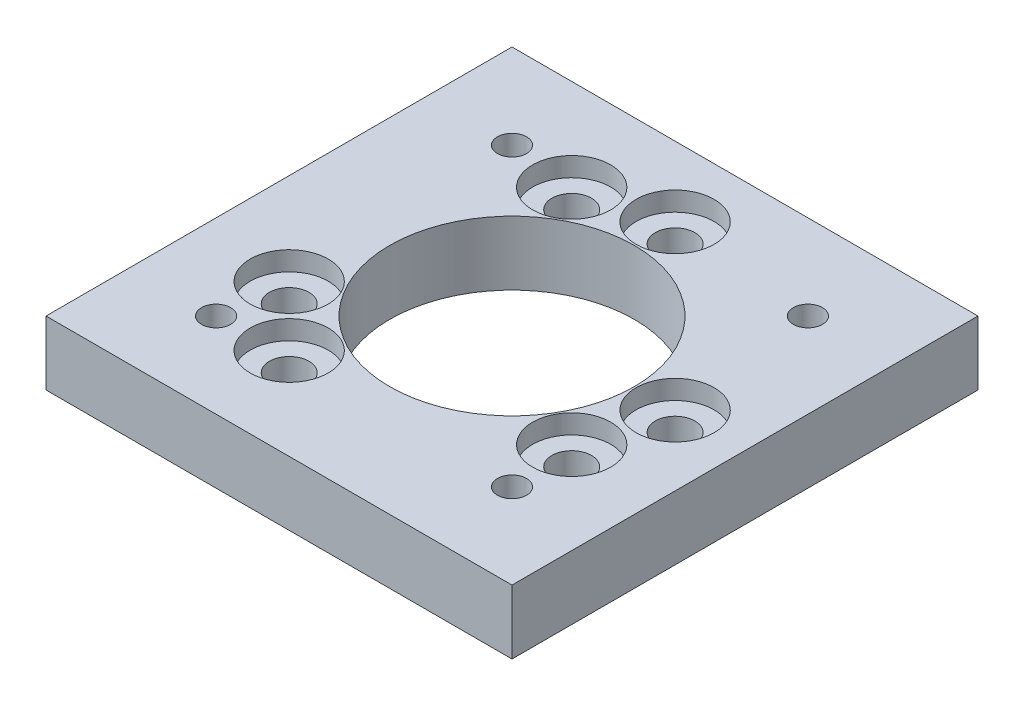
ISO-10303-21;
HEADER;
FILE_DESCRIPTION(('STEP AP214'),'2;1');
FILE_NAME('part.step','',(''),(''),'','','');
FILE_SCHEMA(('AUTOMOTIVE_DESIGN { 1 0 10303 214 1 1 1 1 }'));
ENDSEC;
DATA;
#1=APPLICATION_CONTEXT('core data for automotive mechanical design processes');
#2=APPLICATION_PROTOCOL_DEFINITION('international standard','automotive_design',2000,#1);
#3=PRODUCT_CONTEXT('',#1,'mechanical');
#4=PRODUCT('Part','Part','',(#3));
#5=PRODUCT_RELATED_PRODUCT_CATEGORY('part','',(#4));
#6=PRODUCT_DEFINITION_FORMATION('','',#4);
#7=PRODUCT_DEFINITION_CONTEXT('part definition',#1,'design');
#8=PRODUCT_DEFINITION('design','',#6,#7);
#9=PRODUCT_DEFINITION_SHAPE('','',#8);
#10=(LENGTH_UNIT() NAMED_UNIT(*) SI_UNIT(.MILLI.,.METRE.));
#11=(NAMED_UNIT(*) PLANE_ANGLE_UNIT() SI_UNIT($,.RADIAN.));
#12=(NAMED_UNIT(*) SI_UNIT($,.STERADIAN.) SOLID_ANGLE_UNIT());
#13=UNCERTAINTY_MEASURE_WITH_UNIT(LENGTH_MEASURE(1.E-05),#10,'distance_accuracy_value','');
#14=(GEOMETRIC_REPRESENTATION_CONTEXT(3) GLOBAL_UNCERTAINTY_ASSIGNED_CONTEXT((#13)) GLOBAL_UNIT_ASSIGNED_CONTEXT((#10,
#11,#12)) REPRESENTATION_CONTEXT('',''));
#15=CARTESIAN_POINT('',(0.,0.,0.));
#16=DIRECTION('',(0.,0.,1.));
#17=DIRECTION('',(1.,0.,0.));
#18=AXIS2_PLACEMENT_3D('',#15,#16,#17);
#19=CARTESIAN_POINT('',(20.,5.5,20.));
#20=DIRECTION('',(-1.,0.,0.));
#21=DIRECTION('',(0.,0.,1.));
#22=AXIS2_PLACEMENT_3D('',#19,#20,#21);
#23=PLANE('',#22);
#24=DIRECTION('',(0.,0.,-1.));
#25=VECTOR('',#24,1.);
#26=CARTESIAN_POINT('',(20.,0.,20.));
#27=LINE('',#26,#25);
#28=CARTESIAN_POINT('',(20.,0.,20.));
#29=VERTEX_POINT('',#28);
#30=CARTESIAN_POINT('',(20.,0.,-20.));
#31=VERTEX_POINT('',#30);
#32=EDGE_CURVE('E111',#29,#31,#27,.T.);
#33=ORIENTED_EDGE('',*,*,#32,.T.);
#34=DIRECTION('',(0.,-1.,0.));
#35=VECTOR('',#34,1.);
#36=CARTESIAN_POINT('',(20.,5.5,-20.));
#37=LINE('',#36,#35);
#38=CARTESIAN_POINT('',(20.,5.5,-20.));
#39=VERTEX_POINT('',#38);
#40=EDGE_CURVE('E11',#39,#31,#37,.T.);
#41=ORIENTED_EDGE('',*,*,#40,.F.);
#42=DIRECTION('',(0.,0.,-1.));
#43=VECTOR('',#42,1.);
#44=CARTESIAN_POINT('',(20.,5.5,20.));
#45=LINE('',#44,#43);
#46=CARTESIAN_POINT('',(20.,5.5,20.));
#47=VERTEX_POINT('',#46);
#48=EDGE_CURVE('E94',#47,#39,#45,.T.);
#49=ORIENTED_EDGE('',*,*,#48,.F.);
#50=DIRECTION('',(0.,-1.,0.));
#51=VECTOR('',#50,1.);
#52=CARTESIAN_POINT('',(20.,5.5,20.));
#53=LINE('',#52,#51);
#54=EDGE_CURVE('E107',#47,#29,#53,.T.);
#55=ORIENTED_EDGE('',*,*,#54,.T.);
#56=EDGE_LOOP('',(#33,#41,#49,#55));
#57=FACE_BOUND('',#56,.T.);
#58=ADVANCED_FACE('F40',(#57),#23,.F.);
#59=CARTESIAN_POINT('',(-20.,5.5,-20.));
#60=DIRECTION('',(0.,0.,1.));
#61=DIRECTION('',(1.,0.,0.));
#62=AXIS2_PLACEMENT_3D('',#59,#60,#61);
#63=PLANE('',#62);
#64=DIRECTION('',(-1.,0.,0.));
#65=VECTOR('',#64,1.);
#66=CARTESIAN_POINT('',(-20.,0.,-20.));
#67=LINE('',#66,#65);
#68=CARTESIAN_POINT('',(-20.,0.,-20.));
#69=VERTEX_POINT('',#68);
#70=EDGE_CURVE('E99',#31,#69,#67,.T.);
#71=ORIENTED_EDGE('',*,*,#70,.T.);
#72=DIRECTION('',(0.,-1.,0.));
#73=VECTOR('',#72,1.);
#74=CARTESIAN_POINT('',(-20.,5.5,-20.));
#75=LINE('',#74,#73);
#76=CARTESIAN_POINT('',(-20.,5.5,-20.));
#77=VERTEX_POINT('',#76);
#78=EDGE_CURVE('E50',#77,#69,#75,.T.);
#79=ORIENTED_EDGE('',*,*,#78,.F.);
#80=DIRECTION('',(-1.,0.,0.));
#81=VECTOR('',#80,1.);
#82=CARTESIAN_POINT('',(-20.,5.5,-20.));
#83=LINE('',#82,#81);
#84=EDGE_CURVE('E89',#39,#77,#83,.T.);
#85=ORIENTED_EDGE('',*,*,#84,.F.);
#86=ORIENTED_EDGE('',*,*,#40,.T.);
#87=EDGE_LOOP('',(#71,#79,#85,#86));
#88=FACE_BOUND('',#87,.T.);
#89=ADVANCED_FACE('F98',(#88),#63,.F.);
#90=CARTESIAN_POINT('',(-20.,5.5,20.));
#91=DIRECTION('',(1.,0.,0.));
#92=DIRECTION('',(0.,0.,-1.));
#93=AXIS2_PLACEMENT_3D('',#90,#91,#92);
#94=PLANE('',#93);
#95=DIRECTION('',(0.,0.,1.));
#96=VECTOR('',#95,1.);
#97=CARTESIAN_POINT('',(-20.,0.,20.));
#98=LINE('',#97,#96);
#99=CARTESIAN_POINT('',(-20.,0.,20.));
#100=VERTEX_POINT('',#99);
#101=EDGE_CURVE('E76',#69,#100,#98,.T.);
#102=ORIENTED_EDGE('',*,*,#101,.T.);
#103=DIRECTION('',(0.,-1.,0.));
#104=VECTOR('',#103,1.);
#105=CARTESIAN_POINT('',(-20.,5.5,20.));
#106=LINE('',#105,#104);
#107=CARTESIAN_POINT('',(-20.,5.5,20.));
#108=VERTEX_POINT('',#107);
#109=EDGE_CURVE('E101',#108,#100,#106,.T.);
#110=ORIENTED_EDGE('',*,*,#109,.F.);
#111=DIRECTION('',(0.,0.,1.));
#112=VECTOR('',#111,1.);
#113=CARTESIAN_POINT('',(-20.,5.5,20.));
#114=LINE('',#113,#112);
#115=EDGE_CURVE('E92',#77,#108,#114,.T.);
#116=ORIENTED_EDGE('',*,*,#115,.F.);
#117=ORIENTED_EDGE('',*,*,#78,.T.);
#118=EDGE_LOOP('',(#102,#110,#116,#117));
#119=FACE_BOUND('',#118,.T.);
#120=ADVANCED_FACE('F103',(#119),#94,.F.);
#121=CARTESIAN_POINT('',(-20.,5.5,20.));
#122=DIRECTION('',(0.,0.,-1.));
#123=DIRECTION('',(-1.,0.,0.));
#124=AXIS2_PLACEMENT_3D('',#121,#122,#123);
#125=PLANE('',#124);
#126=DIRECTION('',(1.,0.,0.));
#127=VECTOR('',#126,1.);
#128=CARTESIAN_POINT('',(-20.,0.,20.));
#129=LINE('',#128,#127);
#130=EDGE_CURVE('E82',#100,#29,#129,.T.);
#131=ORIENTED_EDGE('',*,*,#130,.T.);
#132=ORIENTED_EDGE('',*,*,#54,.F.);
#133=DIRECTION('',(1.,0.,0.));
#134=VECTOR('',#133,1.);
#135=CARTESIAN_POINT('',(-20.,5.5,20.));
#136=LINE('',#135,#134);
#137=EDGE_CURVE('E59',#108,#47,#136,.T.);
#138=ORIENTED_EDGE('',*,*,#137,.F.);
#139=ORIENTED_EDGE('',*,*,#109,.T.);
#140=EDGE_LOOP('',(#131,#132,#138,#139));
#141=FACE_BOUND('',#140,.T.);
#142=ADVANCED_FACE('F259',(#141),#125,.F.);
#143=CARTESIAN_POINT('',(0.,5.5,0.));
#144=DIRECTION('',(0.,-1.,0.));
#145=DIRECTION('',(0.,0.,-1.));
#146=AXIS2_PLACEMENT_3D('',#143,#144,#145);
#147=PLANE('',#146);
#148=CARTESIAN_POINT('',(-2.21177243187043E-13,5.5,-14.));
#149=DIRECTION('',(0.,1.,0.));
#150=DIRECTION('',(0.,0.,1.));
#151=AXIS2_PLACEMENT_3D('',#148,#149,#150);
#152=CIRCLE('',#151,3.35);
#153=CARTESIAN_POINT('',(-2.21177243187043E-13,5.5,-10.65));
#154=VERTEX_POINT('',#153);
#155=EDGE_CURVE('E536',#154,#154,#152,.T.);
#156=ORIENTED_EDGE('',*,*,#155,.F.);
#157=EDGE_LOOP('',(#156));
#158=FACE_BOUND('',#157,.T.);
#159=CARTESIAN_POINT('',(-7.00000000000012,5.5,-12.1243556529821));
#160=DIRECTION('',(0.,1.,0.));
#161=DIRECTION('',(0.,0.,1.));
#162=AXIS2_PLACEMENT_3D('',#159,#160,#161);
#163=CIRCLE('',#162,3.35);
#164=CARTESIAN_POINT('',(-7.00000000000012,5.5,-8.77435565298207));
#165=VERTEX_POINT('',#164);
#166=EDGE_CURVE('E174',#165,#165,#163,.T.);
#167=ORIENTED_EDGE('',*,*,#166,.F.);
#168=EDGE_LOOP('',(#167));
#169=FACE_BOUND('',#168,.T.);
#170=CARTESIAN_POINT('',(12.1243556529822,5.5,6.99999999999987));
#171=DIRECTION('',(0.,1.,0.));
#172=DIRECTION('',(0.,0.,1.));
#173=AXIS2_PLACEMENT_3D('',#170,#171,#172);
#174=CIRCLE('',#173,3.35);
#175=CARTESIAN_POINT('',(12.1243556529822,5.5,10.3499999999999));
#176=VERTEX_POINT('',#175);
#177=EDGE_CURVE('E158',#176,#176,#174,.T.);
#178=ORIENTED_EDGE('',*,*,#177,.F.);
#179=EDGE_LOOP('',(#178));
#180=FACE_BOUND('',#179,.T.);
#181=CARTESIAN_POINT('',(14.,5.5,0.));
#182=DIRECTION('',(0.,1.,0.));
#183=DIRECTION('',(0.,0.,1.));
#184=AXIS2_PLACEMENT_3D('',#181,#182,#183);
#185=CIRCLE('',#184,3.35);
#186=CARTESIAN_POINT('',(14.,5.5,3.34999999999993));
#187=VERTEX_POINT('',#186);
#188=EDGE_CURVE('E153',#187,#187,#185,.T.);
#189=ORIENTED_EDGE('',*,*,#188,.F.);
#190=EDGE_LOOP('',(#189));
#191=FACE_BOUND('',#190,.T.);
#192=CARTESIAN_POINT('',(-12.1243556529821,5.5,7.00000000000008));
#193=DIRECTION('',(0.,1.,0.));
#194=DIRECTION('',(0.,0.,1.));
#195=AXIS2_PLACEMENT_3D('',#192,#193,#194);
#196=CIRCLE('',#195,3.35);
#197=CARTESIAN_POINT('',(-12.1243556529821,5.5,10.3500000000001));
#198=VERTEX_POINT('',#197);
#199=EDGE_CURVE('E148',#198,#198,#196,.T.);
#200=ORIENTED_EDGE('',*,*,#199,.F.);
#201=EDGE_LOOP('',(#200));
#202=FACE_BOUND('',#201,.T.);
#203=CARTESIAN_POINT('',(-6.99999999999999,5.5,12.1243556529821));
#204=DIRECTION('',(0.,1.,0.));
#205=DIRECTION('',(0.,0.,1.));
#206=AXIS2_PLACEMENT_3D('',#203,#204,#205);
#207=CIRCLE('',#206,3.35);
#208=CARTESIAN_POINT('',(-6.99999999999999,5.5,15.4743556529821));
#209=VERTEX_POINT('',#208);
#210=EDGE_CURVE('E142',#209,#209,#207,.T.);
#211=ORIENTED_EDGE('',*,*,#210,.F.);
#212=EDGE_LOOP('',(#211));
#213=FACE_BOUND('',#212,.T.);
#214=CARTESIAN_POINT('',(-12.7,5.5,12.7));
#215=DIRECTION('',(0.,1.,0.));
#216=DIRECTION('',(0.,0.,1.));
#217=AXIS2_PLACEMENT_3D('',#214,#215,#216);
#218=CIRCLE('',#217,1.25);
#219=CARTESIAN_POINT('',(-12.7,5.5,13.95));
#220=VERTEX_POINT('',#219);
#221=EDGE_CURVE('E136',#220,#220,#218,.T.);
#222=ORIENTED_EDGE('',*,*,#221,.F.);
#223=EDGE_LOOP('',(#222));
#224=FACE_BOUND('',#223,.T.);
#225=CARTESIAN_POINT('',(-12.7,5.5,-12.7));
#226=DIRECTION('',(0.,1.,0.));
#227=DIRECTION('',(0.,0.,1.));
#228=AXIS2_PLACEMENT_3D('',#225,#226,#227);
#229=CIRCLE('',#228,1.25);
#230=CARTESIAN_POINT('',(-12.7,5.5,-11.45));
#231=VERTEX_POINT('',#230);
#232=EDGE_CURVE('E131',#231,#231,#229,.T.);
#233=ORIENTED_EDGE('',*,*,#232,.F.);
#234=EDGE_LOOP('',(#233));
#235=FACE_BOUND('',#234,.T.);
#236=CARTESIAN_POINT('',(12.7,5.5,-12.7));
#237=DIRECTION('',(0.,1.,0.));
#238=DIRECTION('',(0.,0.,1.));
#239=AXIS2_PLACEMENT_3D('',#236,#237,#238);
#240=CIRCLE('',#239,1.25);
#241=CARTESIAN_POINT('',(12.7,5.5,-11.45));
#242=VERTEX_POINT('',#241);
#243=EDGE_CURVE('E130',#242,#242,#240,.T.);
#244=ORIENTED_EDGE('',*,*,#243,.F.);
#245=EDGE_LOOP('',(#244));
#246=FACE_BOUND('',#245,.T.);
#247=CARTESIAN_POINT('',(12.7,5.5,12.7));
#248=DIRECTION('',(0.,1.,0.));
#249=DIRECTION('',(0.,0.,1.));
#250=AXIS2_PLACEMENT_3D('',#247,#248,#249);
#251=CIRCLE('',#250,1.25);
#252=CARTESIAN_POINT('',(12.7,5.5,13.95));
#253=VERTEX_POINT('',#252);
#254=EDGE_CURVE('E231',#253,#253,#251,.T.);
#255=ORIENTED_EDGE('',*,*,#254,.F.);
#256=EDGE_LOOP('',(#255));
#257=FACE_BOUND('',#256,.T.);
#258=CARTESIAN_POINT('',(0.,5.5,0.));
#259=DIRECTION('',(0.,1.,0.));
#260=DIRECTION('',(0.,0.,1.));
#261=AXIS2_PLACEMENT_3D('',#258,#259,#260);
#262=CIRCLE('',#261,10.5);
#263=CARTESIAN_POINT('',(0.,5.5,10.5));
#264=VERTEX_POINT('',#263);
#265=EDGE_CURVE('E115',#264,#264,#262,.T.);
#266=ORIENTED_EDGE('',*,*,#265,.F.);
#267=EDGE_LOOP('',(#266));
#268=FACE_BOUND('',#267,.T.);
#269=ORIENTED_EDGE('',*,*,#48,.T.);
#270=ORIENTED_EDGE('',*,*,#84,.T.);
#271=ORIENTED_EDGE('',*,*,#115,.T.);
#272=ORIENTED_EDGE('',*,*,#137,.T.);
#273=EDGE_LOOP('',(#269,#270,#271,#272));
#274=FACE_BOUND('',#273,.T.);
#275=ADVANCED_FACE('F90',(#158,#169,#180,#191,#202,#213,#224,#235,#246,#257,#268,#274),#147,.F.);
#276=CARTESIAN_POINT('',(0.,0.,0.));
#277=DIRECTION('',(0.,-1.,0.));
#278=DIRECTION('',(0.,0.,-1.));
#279=AXIS2_PLACEMENT_3D('',#276,#277,#278);
#280=PLANE('',#279);
#281=CARTESIAN_POINT('',(-2.21177243187043E-13,0.,-14.));
#282=DIRECTION('',(0.,-1.,0.));
#283=DIRECTION('',(0.,0.,-1.));
#284=AXIS2_PLACEMENT_3D('',#281,#282,#283);
#285=CIRCLE('',#284,1.7);
#286=CARTESIAN_POINT('',(-2.21177243187043E-13,0.,-15.7));
#287=VERTEX_POINT('',#286);
#288=EDGE_CURVE('E43',#287,#287,#285,.T.);
#289=ORIENTED_EDGE('',*,*,#288,.F.);
#290=EDGE_LOOP('',(#289));
#291=FACE_BOUND('',#290,.T.);
#292=CARTESIAN_POINT('',(-7.00000000000012,0.,-12.1243556529821));
#293=DIRECTION('',(0.,-1.,0.));
#294=DIRECTION('',(0.,0.,-1.));
#295=AXIS2_PLACEMENT_3D('',#292,#293,#294);
#296=CIRCLE('',#295,1.7);
#297=CARTESIAN_POINT('',(-7.00000000000012,0.,-13.8243556529821));
#298=VERTEX_POINT('',#297);
#299=EDGE_CURVE('E155',#298,#298,#296,.T.);
#300=ORIENTED_EDGE('',*,*,#299,.F.);
#301=EDGE_LOOP('',(#300));
#302=FACE_BOUND('',#301,.T.);
#303=CARTESIAN_POINT('',(12.1243556529822,0.,6.99999999999987));
#304=DIRECTION('',(0.,-1.,0.));
#305=DIRECTION('',(0.,0.,-1.));
#306=AXIS2_PLACEMENT_3D('',#303,#304,#305);
#307=CIRCLE('',#306,1.7);
#308=CARTESIAN_POINT('',(12.1243556529822,0.,5.29999999999987));
#309=VERTEX_POINT('',#308);
#310=EDGE_CURVE('E150',#309,#309,#307,.T.);
#311=ORIENTED_EDGE('',*,*,#310,.F.);
#312=EDGE_LOOP('',(#311));
#313=FACE_BOUND('',#312,.T.);
#314=CARTESIAN_POINT('',(14.,0.,0.));
#315=DIRECTION('',(0.,-1.,0.));
#316=DIRECTION('',(0.,0.,-1.));
#317=AXIS2_PLACEMENT_3D('',#314,#315,#316);
#318=CIRCLE('',#317,1.7);
#319=CARTESIAN_POINT('',(14.,0.,-1.70000000000007));
#320=VERTEX_POINT('',#319);
#321=EDGE_CURVE('E144',#320,#320,#318,.T.);
#322=ORIENTED_EDGE('',*,*,#321,.F.);
#323=EDGE_LOOP('',(#322));
#324=FACE_BOUND('',#323,.T.);
#325=CARTESIAN_POINT('',(-12.1243556529821,0.,7.00000000000008));
#326=DIRECTION('',(0.,-1.,0.));
#327=DIRECTION('',(0.,0.,-1.));
#328=AXIS2_PLACEMENT_3D('',#325,#326,#327);
#329=CIRCLE('',#328,1.7);
#330=CARTESIAN_POINT('',(-12.1243556529821,0.,5.30000000000008));
#331=VERTEX_POINT('',#330);
#332=EDGE_CURVE('E138',#331,#331,#329,.T.);
#333=ORIENTED_EDGE('',*,*,#332,.F.);
#334=EDGE_LOOP('',(#333));
#335=FACE_BOUND('',#334,.T.);
#336=CARTESIAN_POINT('',(-6.99999999999999,0.,12.1243556529821));
#337=DIRECTION('',(0.,-1.,0.));
#338=DIRECTION('',(0.,0.,-1.));
#339=AXIS2_PLACEMENT_3D('',#336,#337,#338);
#340=CIRCLE('',#339,1.7);
#341=CARTESIAN_POINT('',(-6.99999999999999,0.,10.4243556529821));
#342=VERTEX_POINT('',#341);
#343=EDGE_CURVE('E132',#342,#342,#340,.T.);
#344=ORIENTED_EDGE('',*,*,#343,.F.);
#345=EDGE_LOOP('',(#344));
#346=FACE_BOUND('',#345,.T.);
#347=CARTESIAN_POINT('',(-12.7,0.,12.7));
#348=DIRECTION('',(0.,-1.,0.));
#349=DIRECTION('',(0.,0.,-1.));
#350=AXIS2_PLACEMENT_3D('',#347,#348,#349);
#351=CIRCLE('',#350,1.25);
#352=CARTESIAN_POINT('',(-12.7,0.,11.45));
#353=VERTEX_POINT('',#352);
#354=EDGE_CURVE('E217',#353,#353,#351,.T.);
#355=ORIENTED_EDGE('',*,*,#354,.F.);
#356=EDGE_LOOP('',(#355));
#357=FACE_BOUND('',#356,.T.);
#358=CARTESIAN_POINT('',(-12.7,0.,-12.7));
#359=DIRECTION('',(0.,-1.,0.));
#360=DIRECTION('',(0.,0.,-1.));
#361=AXIS2_PLACEMENT_3D('',#358,#359,#360);
#362=CIRCLE('',#361,1.25);
#363=CARTESIAN_POINT('',(-12.7,0.,-13.95));
#364=VERTEX_POINT('',#363);
#365=EDGE_CURVE('E126',#364,#364,#362,.T.);
#366=ORIENTED_EDGE('',*,*,#365,.F.);
#367=EDGE_LOOP('',(#366));
#368=FACE_BOUND('',#367,.T.);
#369=CARTESIAN_POINT('',(12.7,0.,-12.7));
#370=DIRECTION('',(0.,-1.,0.));
#371=DIRECTION('',(0.,0.,-1.));
#372=AXIS2_PLACEMENT_3D('',#369,#370,#371);
#373=CIRCLE('',#372,1.25);
#374=CARTESIAN_POINT('',(12.7,0.,-13.95));
#375=VERTEX_POINT('',#374);
#376=EDGE_CURVE('E227',#375,#375,#373,.T.);
#377=ORIENTED_EDGE('',*,*,#376,.F.);
#378=EDGE_LOOP('',(#377));
#379=FACE_BOUND('',#378,.T.);
#380=CARTESIAN_POINT('',(12.7,0.,12.7));
#381=DIRECTION('',(0.,-1.,0.));
#382=DIRECTION('',(0.,0.,-1.));
#383=AXIS2_PLACEMENT_3D('',#380,#381,#382);
#384=CIRCLE('',#383,1.25);
#385=CARTESIAN_POINT('',(12.7,0.,11.45));
#386=VERTEX_POINT('',#385);
#387=EDGE_CURVE('E235',#386,#386,#384,.T.);
#388=ORIENTED_EDGE('',*,*,#387,.F.);
#389=EDGE_LOOP('',(#388));
#390=FACE_BOUND('',#389,.T.);
#391=CARTESIAN_POINT('',(0.,0.,0.));
#392=DIRECTION('',(0.,-1.,0.));
#393=DIRECTION('',(0.,0.,-1.));
#394=AXIS2_PLACEMENT_3D('',#391,#392,#393);
#395=CIRCLE('',#394,10.5);
#396=CARTESIAN_POINT('',(0.,0.,10.5));
#397=VERTEX_POINT('',#396);
#398=EDGE_CURVE('E239',#397,#397,#395,.F.);
#399=ORIENTED_EDGE('',*,*,#398,.T.);
#400=EDGE_LOOP('',(#399));
#401=FACE_BOUND('',#400,.T.);
#402=ORIENTED_EDGE('',*,*,#32,.F.);
#403=ORIENTED_EDGE('',*,*,#130,.F.);
#404=ORIENTED_EDGE('',*,*,#101,.F.);
#405=ORIENTED_EDGE('',*,*,#70,.F.);
#406=EDGE_LOOP('',(#402,#403,#404,#405));
#407=FACE_BOUND('',#406,.T.);
#408=ADVANCED_FACE('F248',(#291,#302,#313,#324,#335,#346,#357,#368,#379,#390,#401,#407),#280,.T.);
#409=CARTESIAN_POINT('',(0.,-0.00100000000000013,0.));
#410=DIRECTION('',(0.,1.,0.));
#411=DIRECTION('',(0.,0.,1.));
#412=AXIS2_PLACEMENT_3D('',#409,#410,#411);
#413=CYLINDRICAL_SURFACE('',#412,10.5);
#414=CARTESIAN_POINT('',(0.,0.,10.5));
#415=CARTESIAN_POINT('',(0.,0.0572916666666666,10.5));
#416=CARTESIAN_POINT('',(0.,0.114583333333333,10.5));
#417=CARTESIAN_POINT('',(0.,0.229166666666667,10.5));
#418=CARTESIAN_POINT('',(0.,0.286458333333333,10.5));
#419=CARTESIAN_POINT('',(0.,0.401041666666667,10.5));
#420=CARTESIAN_POINT('',(0.,0.458333333333333,10.5));
#421=CARTESIAN_POINT('',(0.,0.572916666666667,10.5));
#422=CARTESIAN_POINT('',(0.,0.630208333333333,10.5));
#423=CARTESIAN_POINT('',(0.,0.744791666666667,10.5));
#424=CARTESIAN_POINT('',(0.,0.802083333333333,10.5));
#425=CARTESIAN_POINT('',(0.,0.916666666666667,10.5));
#426=CARTESIAN_POINT('',(0.,0.973958333333333,10.5));
#427=CARTESIAN_POINT('',(0.,1.08854166666667,10.5));
#428=CARTESIAN_POINT('',(0.,1.14583333333333,10.5));
#429=CARTESIAN_POINT('',(0.,1.26041666666667,10.5));
#430=CARTESIAN_POINT('',(0.,1.31770833333333,10.5));
#431=CARTESIAN_POINT('',(0.,1.43229166666667,10.5));
#432=CARTESIAN_POINT('',(0.,1.48958333333333,10.5));
#433=CARTESIAN_POINT('',(0.,1.60416666666667,10.5));
#434=CARTESIAN_POINT('',(0.,1.66145833333333,10.5));
#435=CARTESIAN_POINT('',(0.,1.77604166666667,10.5));
#436=CARTESIAN_POINT('',(0.,1.83333333333333,10.5));
#437=CARTESIAN_POINT('',(0.,1.94791666666667,10.5));
#438=CARTESIAN_POINT('',(0.,2.00520833333333,10.5));
#439=CARTESIAN_POINT('',(0.,2.11979166666667,10.5));
#440=CARTESIAN_POINT('',(0.,2.17708333333333,10.5));
#441=CARTESIAN_POINT('',(0.,2.29166666666667,10.5));
#442=CARTESIAN_POINT('',(0.,2.34895833333333,10.5));
#443=CARTESIAN_POINT('',(0.,2.46354166666667,10.5));
#444=CARTESIAN_POINT('',(0.,2.52083333333333,10.5));
#445=CARTESIAN_POINT('',(0.,2.63541666666667,10.5));
#446=CARTESIAN_POINT('',(0.,2.69270833333333,10.5));
#447=CARTESIAN_POINT('',(0.,2.80729166666667,10.5));
#448=CARTESIAN_POINT('',(0.,2.86458333333333,10.5));
#449=CARTESIAN_POINT('',(0.,2.97916666666667,10.5));
#450=CARTESIAN_POINT('',(0.,3.03645833333333,10.5));
#451=CARTESIAN_POINT('',(0.,3.15104166666667,10.5));
#452=CARTESIAN_POINT('',(0.,3.20833333333333,10.5));
#453=CARTESIAN_POINT('',(0.,3.32291666666667,10.5));
#454=CARTESIAN_POINT('',(0.,3.38020833333333,10.5));
#455=CARTESIAN_POINT('',(0.,3.49479166666667,10.5));
#456=CARTESIAN_POINT('',(0.,3.55208333333333,10.5));
#457=CARTESIAN_POINT('',(0.,3.66666666666667,10.5));
#458=CARTESIAN_POINT('',(0.,3.72395833333333,10.5));
#459=CARTESIAN_POINT('',(0.,3.83854166666667,10.5));
#460=CARTESIAN_POINT('',(0.,3.89583333333333,10.5));
#461=CARTESIAN_POINT('',(0.,4.01041666666667,10.5));
#462=CARTESIAN_POINT('',(0.,4.06770833333333,10.5));
#463=CARTESIAN_POINT('',(0.,4.18229166666667,10.5));
#464=CARTESIAN_POINT('',(0.,4.23958333333333,10.5));
#465=CARTESIAN_POINT('',(0.,4.35416666666667,10.5));
#466=CARTESIAN_POINT('',(0.,4.41145833333333,10.5));
#467=CARTESIAN_POINT('',(0.,4.52604166666667,10.5));
#468=CARTESIAN_POINT('',(0.,4.58333333333333,10.5));
#469=CARTESIAN_POINT('',(0.,4.69791666666667,10.5));
#470=CARTESIAN_POINT('',(0.,4.75520833333333,10.5));
#471=CARTESIAN_POINT('',(0.,4.86979166666667,10.5));
#472=CARTESIAN_POINT('',(0.,4.92708333333333,10.5));
#473=CARTESIAN_POINT('',(0.,5.04166666666667,10.5));
#474=CARTESIAN_POINT('',(0.,5.09895833333333,10.5));
#475=CARTESIAN_POINT('',(0.,5.21354166666667,10.5));
#476=CARTESIAN_POINT('',(0.,5.27083333333333,10.5));
#477=CARTESIAN_POINT('',(0.,5.38541666666667,10.5));
#478=CARTESIAN_POINT('',(0.,5.44270833333333,10.5));
#479=CARTESIAN_POINT('',(0.,5.5,10.5));
#480=B_SPLINE_CURVE_WITH_KNOTS('',3,(#414,#415,#416,#417,#418,#419,#420,#421,#422,#423,#424,
#425,#426,#427,#428,#429,#430,#431,#432,#433,#434,#435,#436,#437,#438,#439,#440,#441,#442,#443,
#444,#445,#446,#447,#448,#449,#450,#451,#452,#453,#454,#455,#456,#457,#458,#459,#460,#461,#462,
#463,#464,#465,#466,#467,#468,#469,#470,#471,#472,#473,#474,#475,#476,#477,#478,#479),
.UNSPECIFIED.,.F.,.F.,(4,2,2,2,2,2,2,2,2,2,2,2,2,2,2,2,2,2,2,2,2,2,2,2,2,2,2,2,2,2,2,2,4),(0.,
0.171875,0.34375,0.515625,0.6875,0.859375,1.03125,1.203125,1.375,1.546875,1.71875,1.890625,
2.0625,2.234375,2.40625,2.578125,2.75,2.921875,3.09375,3.265625,3.4375,3.609375,3.78125,
3.953125,4.125,4.296875,4.46875,4.640625,4.8125,4.984375,5.15625,5.328125,5.5),.UNSPECIFIED.);
#481=EDGE_CURVE('BSEAM251',#397,#264,#480,.T.);
#482=ORIENTED_EDGE('',*,*,#398,.F.);
#483=ORIENTED_EDGE('',*,*,#265,.T.);
#484=ORIENTED_EDGE('',*,*,#481,.T.);
#485=ORIENTED_EDGE('',*,*,#481,.F.);
#486=EDGE_LOOP('',(#482,#484,#483,#485));
#487=FACE_BOUND('',#486,.T.);
#488=ADVANCED_FACE('F251',(#487),#413,.F.);
#489=CARTESIAN_POINT('',(12.7,5.5,12.7));
#490=DIRECTION('',(0.,1.,0.));
#491=DIRECTION('',(0.,0.,1.));
#492=AXIS2_PLACEMENT_3D('',#489,#490,#491);
#493=CYLINDRICAL_SURFACE('',#492,1.25);
#494=ORIENTED_EDGE('',*,*,#387,.T.);
#495=EDGE_LOOP('',(#494));
#496=FACE_BOUND('',#495,.T.);
#497=ORIENTED_EDGE('',*,*,#254,.T.);
#498=EDGE_LOOP('',(#497));
#499=FACE_BOUND('',#498,.T.);
#500=ADVANCED_FACE('F254',(#496,#499),#493,.F.);
#501=CARTESIAN_POINT('',(12.7,5.5,-12.7));
#502=DIRECTION('',(0.,1.,0.));
#503=DIRECTION('',(0.,0.,1.));
#504=AXIS2_PLACEMENT_3D('',#501,#502,#503);
#505=CYLINDRICAL_SURFACE('',#504,1.25);
#506=ORIENTED_EDGE('',*,*,#376,.T.);
#507=EDGE_LOOP('',(#506));
#508=FACE_BOUND('',#507,.T.);
#509=ORIENTED_EDGE('',*,*,#243,.T.);
#510=EDGE_LOOP('',(#509));
#511=FACE_BOUND('',#510,.T.);
#512=ADVANCED_FACE('F310',(#508,#511),#505,.F.);
#513=CARTESIAN_POINT('',(-12.7,5.5,-12.7));
#514=DIRECTION('',(0.,1.,0.));
#515=DIRECTION('',(0.,0.,1.));
#516=AXIS2_PLACEMENT_3D('',#513,#514,#515);
#517=CYLINDRICAL_SURFACE('',#516,1.25);
#518=ORIENTED_EDGE('',*,*,#365,.T.);
#519=EDGE_LOOP('',(#518));
#520=FACE_BOUND('',#519,.T.);
#521=ORIENTED_EDGE('',*,*,#232,.T.);
#522=EDGE_LOOP('',(#521));
#523=FACE_BOUND('',#522,.T.);
#524=ADVANCED_FACE('F317',(#520,#523),#517,.F.);
#525=CARTESIAN_POINT('',(-12.7,5.5,12.7));
#526=DIRECTION('',(0.,1.,0.));
#527=DIRECTION('',(0.,0.,1.));
#528=AXIS2_PLACEMENT_3D('',#525,#526,#527);
#529=CYLINDRICAL_SURFACE('',#528,1.25);
#530=ORIENTED_EDGE('',*,*,#354,.T.);
#531=EDGE_LOOP('',(#530));
#532=FACE_BOUND('',#531,.T.);
#533=ORIENTED_EDGE('',*,*,#221,.T.);
#534=EDGE_LOOP('',(#533));
#535=FACE_BOUND('',#534,.T.);
#536=ADVANCED_FACE('F325',(#532,#535),#529,.F.);
#537=CARTESIAN_POINT('',(-6.99999999999999,5.5,12.1243556529821));
#538=DIRECTION('',(0.,1.,0.));
#539=DIRECTION('',(0.,0.,1.));
#540=AXIS2_PLACEMENT_3D('',#537,#538,#539);
#541=CYLINDRICAL_SURFACE('',#540,1.7);
#542=ORIENTED_EDGE('',*,*,#343,.T.);
#543=EDGE_LOOP('',(#542));
#544=FACE_BOUND('',#543,.T.);
#545=CARTESIAN_POINT('',(-6.99999999999999,3.85,12.1243556529821));
#546=DIRECTION('',(0.,1.,0.));
#547=DIRECTION('',(0.,0.,1.));
#548=AXIS2_PLACEMENT_3D('',#545,#546,#547);
#549=CIRCLE('',#548,1.7);
#550=CARTESIAN_POINT('',(-6.99999999999999,3.85,13.8243556529821));
#551=VERTEX_POINT('',#550);
#552=EDGE_CURVE('E137',#551,#551,#549,.T.);
#553=ORIENTED_EDGE('',*,*,#552,.T.);
#554=EDGE_LOOP('',(#553));
#555=FACE_BOUND('',#554,.T.);
#556=ADVANCED_FACE('F333',(#544,#555),#541,.F.);
#557=CARTESIAN_POINT('',(-5.29999999999999,3.85,12.1243556529821));
#558=DIRECTION('',(0.,-1.,0.));
#559=DIRECTION('',(0.,0.,-1.));
#560=AXIS2_PLACEMENT_3D('',#557,#558,#559);
#561=PLANE('',#560);
#562=ORIENTED_EDGE('',*,*,#552,.F.);
#563=EDGE_LOOP('',(#562));
#564=FACE_BOUND('',#563,.T.);
#565=CARTESIAN_POINT('',(-6.99999999999999,3.85,12.1243556529821));
#566=DIRECTION('',(0.,1.,0.));
#567=DIRECTION('',(0.,0.,1.));
#568=AXIS2_PLACEMENT_3D('',#565,#566,#567);
#569=CIRCLE('',#568,3.35);
#570=CARTESIAN_POINT('',(-6.99999999999999,3.85,15.4743556529821));
#571=VERTEX_POINT('',#570);
#572=EDGE_CURVE('E207',#571,#571,#569,.T.);
#573=ORIENTED_EDGE('',*,*,#572,.T.);
#574=EDGE_LOOP('',(#573));
#575=FACE_BOUND('',#574,.T.);
#576=ADVANCED_FACE('F341',(#564,#575),#561,.F.);
#577=CARTESIAN_POINT('',(-6.99999999999999,5.5,12.1243556529821));
#578=DIRECTION('',(0.,1.,0.));
#579=DIRECTION('',(0.,0.,1.));
#580=AXIS2_PLACEMENT_3D('',#577,#578,#579);
#581=CYLINDRICAL_SURFACE('',#580,3.35);
#582=ORIENTED_EDGE('',*,*,#572,.F.);
#583=EDGE_LOOP('',(#582));
#584=FACE_BOUND('',#583,.T.);
#585=ORIENTED_EDGE('',*,*,#210,.T.);
#586=EDGE_LOOP('',(#585));
#587=FACE_BOUND('',#586,.T.);
#588=ADVANCED_FACE('F349',(#584,#587),#581,.F.);
#589=CARTESIAN_POINT('',(-12.1243556529821,5.5,7.00000000000008));
#590=DIRECTION('',(0.,1.,0.));
#591=DIRECTION('',(0.,0.,1.));
#592=AXIS2_PLACEMENT_3D('',#589,#590,#591);
#593=CYLINDRICAL_SURFACE('',#592,1.7);
#594=ORIENTED_EDGE('',*,*,#332,.T.);
#595=EDGE_LOOP('',(#594));
#596=FACE_BOUND('',#595,.T.);
#597=CARTESIAN_POINT('',(-12.1243556529821,3.85,7.00000000000008));
#598=DIRECTION('',(0.,1.,0.));
#599=DIRECTION('',(0.,0.,1.));
#600=AXIS2_PLACEMENT_3D('',#597,#598,#599);
#601=CIRCLE('',#600,1.7);
#602=CARTESIAN_POINT('',(-12.1243556529821,3.85,8.70000000000008));
#603=VERTEX_POINT('',#602);
#604=EDGE_CURVE('E143',#603,#603,#601,.T.);
#605=ORIENTED_EDGE('',*,*,#604,.T.);
#606=EDGE_LOOP('',(#605));
#607=FACE_BOUND('',#606,.T.);
#608=ADVANCED_FACE('F357',(#596,#607),#593,.F.);
#609=CARTESIAN_POINT('',(-10.4243556529821,3.85,7.00000000000008));
#610=DIRECTION('',(0.,-1.,0.));
#611=DIRECTION('',(0.,0.,-1.));
#612=AXIS2_PLACEMENT_3D('',#609,#610,#611);
#613=PLANE('',#612);
#614=ORIENTED_EDGE('',*,*,#604,.F.);
#615=EDGE_LOOP('',(#614));
#616=FACE_BOUND('',#615,.T.);
#617=CARTESIAN_POINT('',(-12.1243556529821,3.85,7.00000000000008));
#618=DIRECTION('',(0.,1.,0.));
#619=DIRECTION('',(0.,0.,1.));
#620=AXIS2_PLACEMENT_3D('',#617,#618,#619);
#621=CIRCLE('',#620,3.35);
#622=CARTESIAN_POINT('',(-12.1243556529821,3.85,10.3500000000001));
#623=VERTEX_POINT('',#622);
#624=EDGE_CURVE('E197',#623,#623,#621,.T.);
#625=ORIENTED_EDGE('',*,*,#624,.T.);
#626=EDGE_LOOP('',(#625));
#627=FACE_BOUND('',#626,.T.);
#628=ADVANCED_FACE('F365',(#616,#627),#613,.F.);
#629=CARTESIAN_POINT('',(-12.1243556529821,5.5,7.00000000000008));
#630=DIRECTION('',(0.,1.,0.));
#631=DIRECTION('',(0.,0.,1.));
#632=AXIS2_PLACEMENT_3D('',#629,#630,#631);
#633=CYLINDRICAL_SURFACE('',#632,3.35);
#634=ORIENTED_EDGE('',*,*,#624,.F.);
#635=EDGE_LOOP('',(#634));
#636=FACE_BOUND('',#635,.T.);
#637=ORIENTED_EDGE('',*,*,#199,.T.);
#638=EDGE_LOOP('',(#637));
#639=FACE_BOUND('',#638,.T.);
#640=ADVANCED_FACE('F373',(#636,#639),#633,.F.);
#641=CARTESIAN_POINT('',(14.,5.5,0.));
#642=DIRECTION('',(0.,1.,0.));
#643=DIRECTION('',(0.,0.,1.));
#644=AXIS2_PLACEMENT_3D('',#641,#642,#643);
#645=CYLINDRICAL_SURFACE('',#644,1.7);
#646=ORIENTED_EDGE('',*,*,#321,.T.);
#647=EDGE_LOOP('',(#646));
#648=FACE_BOUND('',#647,.T.);
#649=CARTESIAN_POINT('',(14.,3.85,0.));
#650=DIRECTION('',(0.,1.,0.));
#651=DIRECTION('',(0.,0.,1.));
#652=AXIS2_PLACEMENT_3D('',#649,#650,#651);
#653=CIRCLE('',#652,1.7);
#654=CARTESIAN_POINT('',(14.,3.85,1.69999999999992));
#655=VERTEX_POINT('',#654);
#656=EDGE_CURVE('E149',#655,#655,#653,.T.);
#657=ORIENTED_EDGE('',*,*,#656,.T.);
#658=EDGE_LOOP('',(#657));
#659=FACE_BOUND('',#658,.T.);
#660=ADVANCED_FACE('F380',(#648,#659),#645,.F.);
#661=CARTESIAN_POINT('',(15.7,3.85,0.));
#662=DIRECTION('',(0.,-1.,0.));
#663=DIRECTION('',(0.,0.,-1.));
#664=AXIS2_PLACEMENT_3D('',#661,#662,#663);
#665=PLANE('',#664);
#666=ORIENTED_EDGE('',*,*,#656,.F.);
#667=EDGE_LOOP('',(#666));
#668=FACE_BOUND('',#667,.T.);
#669=CARTESIAN_POINT('',(14.,3.85,0.));
#670=DIRECTION('',(0.,1.,0.));
#671=DIRECTION('',(0.,0.,1.));
#672=AXIS2_PLACEMENT_3D('',#669,#670,#671);
#673=CIRCLE('',#672,3.35);
#674=CARTESIAN_POINT('',(14.,3.85,3.34999999999992));
#675=VERTEX_POINT('',#674);
#676=EDGE_CURVE('E187',#675,#675,#673,.T.);
#677=ORIENTED_EDGE('',*,*,#676,.T.);
#678=EDGE_LOOP('',(#677));
#679=FACE_BOUND('',#678,.T.);
#680=ADVANCED_FACE('F387',(#668,#679),#665,.F.);
#681=CARTESIAN_POINT('',(14.,5.5,0.));
#682=DIRECTION('',(0.,1.,0.));
#683=DIRECTION('',(0.,0.,1.));
#684=AXIS2_PLACEMENT_3D('',#681,#682,#683);
#685=CYLINDRICAL_SURFACE('',#684,3.35);
#686=ORIENTED_EDGE('',*,*,#676,.F.);
#687=EDGE_LOOP('',(#686));
#688=FACE_BOUND('',#687,.T.);
#689=ORIENTED_EDGE('',*,*,#188,.T.);
#690=EDGE_LOOP('',(#689));
#691=FACE_BOUND('',#690,.T.);
#692=ADVANCED_FACE('F395',(#688,#691),#685,.F.);
#693=CARTESIAN_POINT('',(12.1243556529822,5.5,6.99999999999987));
#694=DIRECTION('',(0.,1.,0.));
#695=DIRECTION('',(0.,0.,1.));
#696=AXIS2_PLACEMENT_3D('',#693,#694,#695);
#697=CYLINDRICAL_SURFACE('',#696,1.7);
#698=ORIENTED_EDGE('',*,*,#310,.T.);
#699=EDGE_LOOP('',(#698));
#700=FACE_BOUND('',#699,.T.);
#701=CARTESIAN_POINT('',(12.1243556529822,3.85,6.99999999999987));
#702=DIRECTION('',(0.,1.,0.));
#703=DIRECTION('',(0.,0.,1.));
#704=AXIS2_PLACEMENT_3D('',#701,#702,#703);
#705=CIRCLE('',#704,1.7);
#706=CARTESIAN_POINT('',(12.1243556529822,3.85,8.69999999999987));
#707=VERTEX_POINT('',#706);
#708=EDGE_CURVE('E154',#707,#707,#705,.T.);
#709=ORIENTED_EDGE('',*,*,#708,.T.);
#710=EDGE_LOOP('',(#709));
#711=FACE_BOUND('',#710,.T.);
#712=ADVANCED_FACE('F403',(#700,#711),#697,.F.);
#713=CARTESIAN_POINT('',(13.8243556529822,3.85,6.99999999999987));
#714=DIRECTION('',(0.,-1.,0.));
#715=DIRECTION('',(0.,0.,-1.));
#716=AXIS2_PLACEMENT_3D('',#713,#714,#715);
#717=PLANE('',#716);
#718=ORIENTED_EDGE('',*,*,#708,.F.);
#719=EDGE_LOOP('',(#718));
#720=FACE_BOUND('',#719,.T.);
#721=CARTESIAN_POINT('',(12.1243556529822,3.85,6.99999999999987));
#722=DIRECTION('',(0.,1.,0.));
#723=DIRECTION('',(0.,0.,1.));
#724=AXIS2_PLACEMENT_3D('',#721,#722,#723);
#725=CIRCLE('',#724,3.35);
#726=CARTESIAN_POINT('',(12.1243556529822,3.85,10.3499999999999));
#727=VERTEX_POINT('',#726);
#728=EDGE_CURVE('E165',#727,#727,#725,.T.);
#729=ORIENTED_EDGE('',*,*,#728,.T.);
#730=EDGE_LOOP('',(#729));
#731=FACE_BOUND('',#730,.T.);
#732=ADVANCED_FACE('F411',(#720,#731),#717,.F.);
#733=CARTESIAN_POINT('',(12.1243556529822,5.5,6.99999999999987));
#734=DIRECTION('',(0.,1.,0.));
#735=DIRECTION('',(0.,0.,1.));
#736=AXIS2_PLACEMENT_3D('',#733,#734,#735);
#737=CYLINDRICAL_SURFACE('',#736,3.35);
#738=ORIENTED_EDGE('',*,*,#728,.F.);
#739=EDGE_LOOP('',(#738));
#740=FACE_BOUND('',#739,.T.);
#741=ORIENTED_EDGE('',*,*,#177,.T.);
#742=EDGE_LOOP('',(#741));
#743=FACE_BOUND('',#742,.T.);
#744=ADVANCED_FACE('F419',(#740,#743),#737,.F.);
#745=CARTESIAN_POINT('',(-7.00000000000012,5.5,-12.1243556529821));
#746=DIRECTION('',(0.,1.,0.));
#747=DIRECTION('',(0.,0.,1.));
#748=AXIS2_PLACEMENT_3D('',#745,#746,#747);
#749=CYLINDRICAL_SURFACE('',#748,1.7);
#750=ORIENTED_EDGE('',*,*,#299,.T.);
#751=EDGE_LOOP('',(#750));
#752=FACE_BOUND('',#751,.T.);
#753=CARTESIAN_POINT('',(-7.00000000000012,3.85,-12.1243556529821));
#754=DIRECTION('',(0.,1.,0.));
#755=DIRECTION('',(0.,0.,1.));
#756=AXIS2_PLACEMENT_3D('',#753,#754,#755);
#757=CIRCLE('',#756,1.7);
#758=CARTESIAN_POINT('',(-7.00000000000012,3.85,-10.4243556529821));
#759=VERTEX_POINT('',#758);
#760=EDGE_CURVE('E159',#759,#759,#757,.T.);
#761=ORIENTED_EDGE('',*,*,#760,.T.);
#762=EDGE_LOOP('',(#761));
#763=FACE_BOUND('',#762,.T.);
#764=ADVANCED_FACE('F427',(#752,#763),#749,.F.);
#765=CARTESIAN_POINT('',(-5.30000000000012,3.85,-12.1243556529821));
#766=DIRECTION('',(0.,-1.,0.));
#767=DIRECTION('',(0.,0.,-1.));
#768=AXIS2_PLACEMENT_3D('',#765,#766,#767);
#769=PLANE('',#768);
#770=ORIENTED_EDGE('',*,*,#760,.F.);
#771=EDGE_LOOP('',(#770));
#772=FACE_BOUND('',#771,.T.);
#773=CARTESIAN_POINT('',(-7.00000000000012,3.85,-12.1243556529821));
#774=DIRECTION('',(0.,1.,0.));
#775=DIRECTION('',(0.,0.,1.));
#776=AXIS2_PLACEMENT_3D('',#773,#774,#775);
#777=CIRCLE('',#776,3.35);
#778=CARTESIAN_POINT('',(-7.00000000000012,3.85,-8.77435565298207));
#779=VERTEX_POINT('',#778);
#780=EDGE_CURVE('E168',#779,#779,#777,.T.);
#781=ORIENTED_EDGE('',*,*,#780,.T.);
#782=EDGE_LOOP('',(#781));
#783=FACE_BOUND('',#782,.T.);
#784=ADVANCED_FACE('F435',(#772,#783),#769,.F.);
#785=CARTESIAN_POINT('',(-7.00000000000012,5.5,-12.1243556529821));
#786=DIRECTION('',(0.,1.,0.));
#787=DIRECTION('',(0.,0.,1.));
#788=AXIS2_PLACEMENT_3D('',#785,#786,#787);
#789=CYLINDRICAL_SURFACE('',#788,3.35);
#790=ORIENTED_EDGE('',*,*,#780,.F.);
#791=EDGE_LOOP('',(#790));
#792=FACE_BOUND('',#791,.T.);
#793=ORIENTED_EDGE('',*,*,#166,.T.);
#794=EDGE_LOOP('',(#793));
#795=FACE_BOUND('',#794,.T.);
#796=ADVANCED_FACE('F442',(#792,#795),#789,.F.);
#797=CARTESIAN_POINT('',(-2.21177243187043E-13,5.5,-14.));
#798=DIRECTION('',(0.,1.,0.));
#799=DIRECTION('',(0.,0.,1.));
#800=AXIS2_PLACEMENT_3D('',#797,#798,#799);
#801=CYLINDRICAL_SURFACE('',#800,1.7);
#802=ORIENTED_EDGE('',*,*,#288,.T.);
#803=EDGE_LOOP('',(#802));
#804=FACE_BOUND('',#803,.T.);
#805=CARTESIAN_POINT('',(-2.21177243187043E-13,3.85,-14.));
#806=DIRECTION('',(0.,1.,0.));
#807=DIRECTION('',(0.,0.,1.));
#808=AXIS2_PLACEMENT_3D('',#805,#806,#807);
#809=CIRCLE('',#808,1.7);
#810=CARTESIAN_POINT('',(-2.21177243187043E-13,3.85,-12.3));
#811=VERTEX_POINT('',#810);
#812=EDGE_CURVE('E540',#811,#811,#809,.T.);
#813=ORIENTED_EDGE('',*,*,#812,.T.);
#814=EDGE_LOOP('',(#813));
#815=FACE_BOUND('',#814,.T.);
#816=ADVANCED_FACE('F450',(#804,#815),#801,.F.);
#817=CARTESIAN_POINT('',(1.69999999999978,3.85,-14.));
#818=DIRECTION('',(0.,-1.,0.));
#819=DIRECTION('',(0.,0.,-1.));
#820=AXIS2_PLACEMENT_3D('',#817,#818,#819);
#821=PLANE('',#820);
#822=ORIENTED_EDGE('',*,*,#812,.F.);
#823=EDGE_LOOP('',(#822));
#824=FACE_BOUND('',#823,.T.);
#825=CARTESIAN_POINT('',(-2.21177243187043E-13,3.85,-14.));
#826=DIRECTION('',(0.,1.,0.));
#827=DIRECTION('',(0.,0.,1.));
#828=AXIS2_PLACEMENT_3D('',#825,#826,#827);
#829=CIRCLE('',#828,3.35);
#830=CARTESIAN_POINT('',(-2.21177243187043E-13,3.85,-10.65));
#831=VERTEX_POINT('',#830);
#832=EDGE_CURVE('E534',#831,#831,#829,.T.);
#833=ORIENTED_EDGE('',*,*,#832,.T.);
#834=EDGE_LOOP('',(#833));
#835=FACE_BOUND('',#834,.T.);
#836=ADVANCED_FACE('F458',(#824,#835),#821,.F.);
#837=CARTESIAN_POINT('',(-2.21177243187043E-13,5.5,-14.));
#838=DIRECTION('',(0.,1.,0.));
#839=DIRECTION('',(0.,0.,1.));
#840=AXIS2_PLACEMENT_3D('',#837,#838,#839);
#841=CYLINDRICAL_SURFACE('',#840,3.35);
#842=ORIENTED_EDGE('',*,*,#832,.F.);
#843=EDGE_LOOP('',(#842));
#844=FACE_BOUND('',#843,.T.);
#845=ORIENTED_EDGE('',*,*,#155,.T.);
#846=EDGE_LOOP('',(#845));
#847=FACE_BOUND('',#846,.T.);
#848=ADVANCED_FACE('F466',(#844,#847),#841,.F.);
#849=CLOSED_SHELL('',(#58,#89,#120,#142,#275,#408,#488,#500,#512,#524,#536,#556,#576,#588,#608,
#628,#640,#660,#680,#692,#712,#732,#744,#764,#784,#796,#816,#836,#848));
#850=MANIFOLD_SOLID_BREP('B2',#849);
#851=ADVANCED_BREP_SHAPE_REPRESENTATION('',(#18,#850),#14);
#852=SHAPE_DEFINITION_REPRESENTATION(#9,#851);
ENDSEC;
END-ISO-10303-21;
